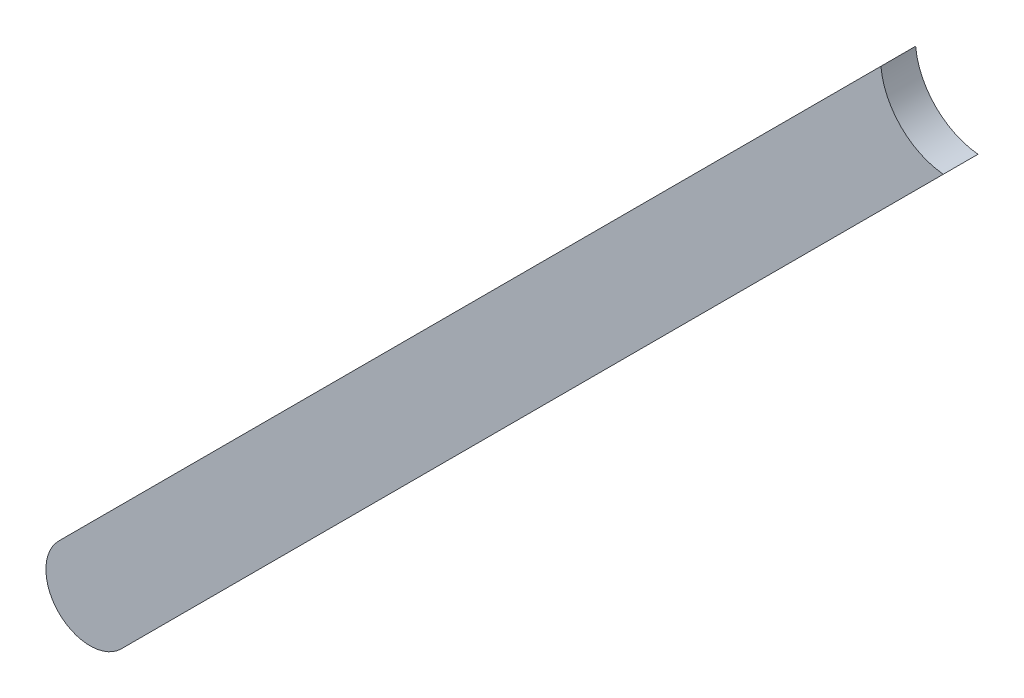
ISO-10303-21;
HEADER;
FILE_DESCRIPTION(('STEP AP214'),'2;1');
FILE_NAME('part.step','',(''),(''),'','','');
FILE_SCHEMA(('AUTOMOTIVE_DESIGN { 1 0 10303 214 1 1 1 1 }'));
ENDSEC;
DATA;
#1=APPLICATION_CONTEXT('core data for automotive mechanical design processes');
#2=APPLICATION_PROTOCOL_DEFINITION('international standard','automotive_design',2000,#1);
#3=PRODUCT_CONTEXT('',#1,'mechanical');
#4=PRODUCT('Part','Part','',(#3));
#5=PRODUCT_RELATED_PRODUCT_CATEGORY('part','',(#4));
#6=PRODUCT_DEFINITION_FORMATION('','',#4);
#7=PRODUCT_DEFINITION_CONTEXT('part definition',#1,'design');
#8=PRODUCT_DEFINITION('design','',#6,#7);
#9=PRODUCT_DEFINITION_SHAPE('','',#8);
#10=(LENGTH_UNIT() NAMED_UNIT(*) SI_UNIT(.MILLI.,.METRE.));
#11=(NAMED_UNIT(*) PLANE_ANGLE_UNIT() SI_UNIT($,.RADIAN.));
#12=(NAMED_UNIT(*) SI_UNIT($,.STERADIAN.) SOLID_ANGLE_UNIT());
#13=UNCERTAINTY_MEASURE_WITH_UNIT(LENGTH_MEASURE(1.E-05),#10,'distance_accuracy_value','');
#14=(GEOMETRIC_REPRESENTATION_CONTEXT(3) GLOBAL_UNCERTAINTY_ASSIGNED_CONTEXT((#13)) GLOBAL_UNIT_ASSIGNED_CONTEXT((#10,
#11,#12)) REPRESENTATION_CONTEXT('',''));
#15=CARTESIAN_POINT('',(0.,0.,0.));
#16=DIRECTION('',(0.,0.,1.));
#17=DIRECTION('',(1.,0.,0.));
#18=AXIS2_PLACEMENT_3D('',#15,#16,#17);
#19=CARTESIAN_POINT('',(107.74860594,67.76539406,0.));
#20=DIRECTION('',(-0.707106781186548,0.707106781186548,0.));
#21=DIRECTION('',(0.707106781186548,0.707106781186548,0.));
#22=AXIS2_PLACEMENT_3D('',#19,#20,#21);
#23=PLANE('',#22);
#24=DIRECTION('',(0.707106781186548,0.707106781186548,0.));
#25=VECTOR('',#24,1.);
#26=CARTESIAN_POINT('',(107.74860594,67.76539406,0.1999996));
#27=LINE('',#26,#25);
#28=CARTESIAN_POINT('',(107.74860594,67.76539406,0.1999996));
#29=VERTEX_POINT('',#28);
#30=CARTESIAN_POINT('',(112.4831079164,72.4998960364002,0.1999996));
#31=VERTEX_POINT('',#30);
#32=EDGE_CURVE('E11',#29,#31,#27,.T.);
#33=ORIENTED_EDGE('',*,*,#32,.F.);
#34=DIRECTION('',(0.,0.,1.));
#35=VECTOR('',#34,1.);
#36=CARTESIAN_POINT('',(107.74860594,67.76539406,0.));
#37=LINE('',#36,#35);
#38=CARTESIAN_POINT('',(107.74860594,67.76539406,0.));
#39=VERTEX_POINT('',#38);
#40=EDGE_CURVE('E24',#39,#29,#37,.T.);
#41=ORIENTED_EDGE('',*,*,#40,.F.);
#42=DIRECTION('',(0.707106781186548,0.707106781186548,0.));
#43=VECTOR('',#42,1.);
#44=CARTESIAN_POINT('',(107.74860594,67.76539406,0.));
#45=LINE('',#44,#43);
#46=CARTESIAN_POINT('',(112.4831079164,72.4998960364002,0.));
#47=VERTEX_POINT('',#46);
#48=EDGE_CURVE('E75',#39,#47,#45,.T.);
#49=ORIENTED_EDGE('',*,*,#48,.T.);
#50=DIRECTION('',(0.,0.,1.));
#51=VECTOR('',#50,1.);
#52=CARTESIAN_POINT('',(112.4831079164,72.4998960364002,0.));
#53=LINE('',#52,#51);
#54=EDGE_CURVE('E37',#47,#31,#53,.T.);
#55=ORIENTED_EDGE('',*,*,#54,.T.);
#56=EDGE_LOOP('',(#33,#41,#49,#55));
#57=FACE_BOUND('',#56,.T.);
#58=ADVANCED_FACE('F17',(#57),#23,.F.);
#59=CARTESIAN_POINT('',(112.522,72.898,0.));
#60=DIRECTION('',(0.,0.,-1.));
#61=DIRECTION('',(1.,0.,0.));
#62=AXIS2_PLACEMENT_3D('',#59,#60,#61);
#63=CYLINDRICAL_SURFACE('',#62,0.3999992);
#64=DIRECTION('',(0.,0.,1.));
#65=VECTOR('',#64,1.);
#66=CARTESIAN_POINT('',(112.1238960364,72.8591079164002,0.));
#67=LINE('',#66,#65);
#68=CARTESIAN_POINT('',(112.1238960364,72.8591079164002,0.));
#69=VERTEX_POINT('',#68);
#70=CARTESIAN_POINT('',(112.1238960364,72.8591079164002,0.1999996));
#71=VERTEX_POINT('',#70);
#72=EDGE_CURVE('E67',#69,#71,#67,.T.);
#73=ORIENTED_EDGE('',*,*,#72,.T.);
#74=CARTESIAN_POINT('',(112.522,72.898,0.1999996));
#75=DIRECTION('',(0.,0.,1.));
#76=DIRECTION('',(1.,0.,0.));
#77=AXIS2_PLACEMENT_3D('',#74,#75,#76);
#78=CIRCLE('',#77,0.3999992);
#79=EDGE_CURVE('E82',#71,#31,#78,.T.);
#80=ORIENTED_EDGE('',*,*,#79,.T.);
#81=ORIENTED_EDGE('',*,*,#54,.F.);
#82=CARTESIAN_POINT('',(112.522,72.898,0.));
#83=DIRECTION('',(0.,0.,1.));
#84=DIRECTION('',(1.,0.,0.));
#85=AXIS2_PLACEMENT_3D('',#82,#83,#84);
#86=CIRCLE('',#85,0.3999992);
#87=EDGE_CURVE('E80',#69,#47,#86,.T.);
#88=ORIENTED_EDGE('',*,*,#87,.F.);
#89=EDGE_LOOP('',(#73,#80,#81,#88));
#90=FACE_BOUND('',#89,.T.);
#91=ADVANCED_FACE('F88',(#90),#63,.F.);
#92=CARTESIAN_POINT('',(112.1238960364,72.8591079164002,0.));
#93=DIRECTION('',(0.707106781186547,-0.707106781186549,0.));
#94=DIRECTION('',(-0.707106781186549,-0.707106781186547,0.));
#95=AXIS2_PLACEMENT_3D('',#92,#93,#94);
#96=PLANE('',#95);
#97=DIRECTION('',(-0.707106781186549,-0.707106781186547,0.));
#98=VECTOR('',#97,1.);
#99=CARTESIAN_POINT('',(112.34239406,73.07760594,0.1999996));
#100=LINE('',#99,#98);
#101=CARTESIAN_POINT('',(107.38939406,68.12460594,0.1999996));
#102=VERTEX_POINT('',#101);
#103=EDGE_CURVE('E71',#71,#102,#100,.T.);
#104=ORIENTED_EDGE('',*,*,#103,.F.);
#105=ORIENTED_EDGE('',*,*,#72,.F.);
#106=DIRECTION('',(-0.707106781186549,-0.707106781186547,0.));
#107=VECTOR('',#106,1.);
#108=CARTESIAN_POINT('',(112.34239406,73.07760594,0.));
#109=LINE('',#108,#107);
#110=CARTESIAN_POINT('',(107.38939406,68.12460594,0.));
#111=VERTEX_POINT('',#110);
#112=EDGE_CURVE('E63',#69,#111,#109,.T.);
#113=ORIENTED_EDGE('',*,*,#112,.T.);
#114=DIRECTION('',(0.,0.,1.));
#115=VECTOR('',#114,1.);
#116=CARTESIAN_POINT('',(107.38939406,68.12460594,0.));
#117=LINE('',#116,#115);
#118=EDGE_CURVE('E53',#111,#102,#117,.T.);
#119=ORIENTED_EDGE('',*,*,#118,.T.);
#120=EDGE_LOOP('',(#104,#105,#113,#119));
#121=FACE_BOUND('',#120,.T.);
#122=ADVANCED_FACE('F66',(#121),#96,.F.);
#123=CARTESIAN_POINT('',(107.569,67.945,0.));
#124=DIRECTION('',(0.,0.,-1.));
#125=DIRECTION('',(-0.70710678118652,0.707106781186576,0.));
#126=AXIS2_PLACEMENT_3D('',#123,#124,#125);
#127=CYLINDRICAL_SURFACE('',#126,0.254001156230774);
#128=CARTESIAN_POINT('',(107.569,67.945,0.1999996));
#129=DIRECTION('',(0.,0.,1.));
#130=DIRECTION('',(-0.70710678118652,0.707106781186576,0.));
#131=AXIS2_PLACEMENT_3D('',#128,#129,#130);
#132=CIRCLE('',#131,0.254001156230774);
#133=EDGE_CURVE('E59',#102,#29,#132,.T.);
#134=ORIENTED_EDGE('',*,*,#133,.F.);
#135=ORIENTED_EDGE('',*,*,#118,.F.);
#136=CARTESIAN_POINT('',(107.569,67.945,0.));
#137=DIRECTION('',(0.,0.,1.));
#138=DIRECTION('',(-0.70710678118652,0.707106781186576,0.));
#139=AXIS2_PLACEMENT_3D('',#136,#137,#138);
#140=CIRCLE('',#139,0.254001156230774);
#141=EDGE_CURVE('E57',#111,#39,#140,.T.);
#142=ORIENTED_EDGE('',*,*,#141,.T.);
#143=ORIENTED_EDGE('',*,*,#40,.T.);
#144=EDGE_LOOP('',(#134,#135,#142,#143));
#145=FACE_BOUND('',#144,.T.);
#146=ADVANCED_FACE('F55',(#145),#127,.T.);
#147=CARTESIAN_POINT('',(107.74860594,67.76539406,0.));
#148=DIRECTION('',(0.,0.,-1.));
#149=DIRECTION('',(-1.,0.,0.));
#150=AXIS2_PLACEMENT_3D('',#147,#148,#149);
#151=PLANE('',#150);
#152=ORIENTED_EDGE('',*,*,#48,.F.);
#153=ORIENTED_EDGE('',*,*,#141,.F.);
#154=ORIENTED_EDGE('',*,*,#112,.F.);
#155=ORIENTED_EDGE('',*,*,#87,.T.);
#156=EDGE_LOOP('',(#152,#153,#154,#155));
#157=FACE_BOUND('',#156,.T.);
#158=ADVANCED_FACE('F74',(#157),#151,.T.);
#159=CARTESIAN_POINT('',(107.74860594,67.76539406,0.1999996));
#160=DIRECTION('',(0.,0.,-1.));
#161=DIRECTION('',(-1.,0.,0.));
#162=AXIS2_PLACEMENT_3D('',#159,#160,#161);
#163=PLANE('',#162);
#164=ORIENTED_EDGE('',*,*,#133,.T.);
#165=ORIENTED_EDGE('',*,*,#32,.T.);
#166=ORIENTED_EDGE('',*,*,#79,.F.);
#167=ORIENTED_EDGE('',*,*,#103,.T.);
#168=EDGE_LOOP('',(#164,#165,#166,#167));
#169=FACE_BOUND('',#168,.T.);
#170=ADVANCED_FACE('F91',(#169),#163,.F.);
#171=CLOSED_SHELL('',(#58,#91,#122,#146,#158,#170));
#172=MANIFOLD_SOLID_BREP('B1',#171);
#173=ADVANCED_BREP_SHAPE_REPRESENTATION('',(#18,#172),#14);
#174=SHAPE_DEFINITION_REPRESENTATION(#9,#173);
ENDSEC;
END-ISO-10303-21;
